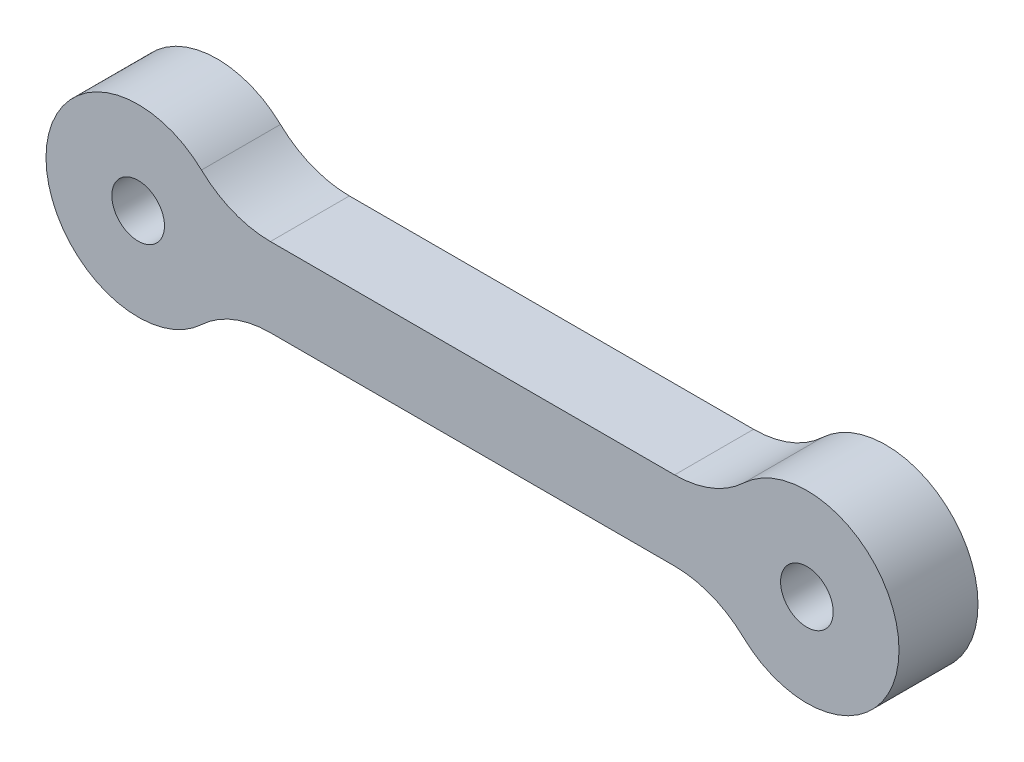
ISO-10303-21;
HEADER;
FILE_DESCRIPTION(('STEP AP214'),'2;1');
FILE_NAME('part.step','',(''),(''),'','','');
FILE_SCHEMA(('AUTOMOTIVE_DESIGN { 1 0 10303 214 1 1 1 1 }'));
ENDSEC;
DATA;
#1=APPLICATION_CONTEXT('core data for automotive mechanical design processes');
#2=APPLICATION_PROTOCOL_DEFINITION('international standard','automotive_design',2000,#1);
#3=PRODUCT_CONTEXT('',#1,'mechanical');
#4=PRODUCT('Part','Part','',(#3));
#5=PRODUCT_RELATED_PRODUCT_CATEGORY('part','',(#4));
#6=PRODUCT_DEFINITION_FORMATION('','',#4);
#7=PRODUCT_DEFINITION_CONTEXT('part definition',#1,'design');
#8=PRODUCT_DEFINITION('design','',#6,#7);
#9=PRODUCT_DEFINITION_SHAPE('','',#8);
#10=(LENGTH_UNIT() NAMED_UNIT(*) SI_UNIT(.MILLI.,.METRE.));
#11=(NAMED_UNIT(*) PLANE_ANGLE_UNIT() SI_UNIT($,.RADIAN.));
#12=(NAMED_UNIT(*) SI_UNIT($,.STERADIAN.) SOLID_ANGLE_UNIT());
#13=UNCERTAINTY_MEASURE_WITH_UNIT(LENGTH_MEASURE(1.E-05),#10,'distance_accuracy_value','');
#14=(GEOMETRIC_REPRESENTATION_CONTEXT(3) GLOBAL_UNCERTAINTY_ASSIGNED_CONTEXT((#13)) GLOBAL_UNIT_ASSIGNED_CONTEXT((#10,
#11,#12)) REPRESENTATION_CONTEXT('',''));
#15=CARTESIAN_POINT('',(0.,0.,0.));
#16=DIRECTION('',(0.,0.,1.));
#17=DIRECTION('',(1.,0.,0.));
#18=AXIS2_PLACEMENT_3D('',#15,#16,#17);
#19=CARTESIAN_POINT('',(12.7,0.,3.));
#20=DIRECTION('',(0.,0.,-1.));
#21=DIRECTION('',(-1.,0.,0.));
#22=AXIS2_PLACEMENT_3D('',#19,#20,#21);
#23=PLANE('',#22);
#24=DIRECTION('',(1.,0.,0.));
#25=VECTOR('',#24,1.);
#26=CARTESIAN_POINT('',(-9.53772233983162,-1.5,3.));
#27=LINE('',#26,#25);
#28=CARTESIAN_POINT('',(-7.6760573251678,-1.5,3.));
#29=VERTEX_POINT('',#28);
#30=CARTESIAN_POINT('',(7.67605732516781,-1.5,3.));
#31=VERTEX_POINT('',#30);
#32=EDGE_CURVE('E128',#29,#31,#27,.T.);
#33=ORIENTED_EDGE('',*,*,#32,.T.);
#34=CARTESIAN_POINT('',(7.67605732516781,-5.31,3.));
#35=DIRECTION('',(0.,0.,-1.));
#36=DIRECTION('',(-1.,0.,0.));
#37=AXIS2_PLACEMENT_3D('',#34,#35,#36);
#38=CIRCLE('',#37,3.81);
#39=CARTESIAN_POINT('',(10.2945554908464,-2.54240766073871,3.));
#40=VERTEX_POINT('',#39);
#41=EDGE_CURVE('E211',#31,#40,#38,.T.);
#42=ORIENTED_EDGE('',*,*,#41,.T.);
#43=CARTESIAN_POINT('',(12.7,0.,3.));
#44=DIRECTION('',(0.,0.,1.));
#45=DIRECTION('',(-1.,0.,0.));
#46=AXIS2_PLACEMENT_3D('',#43,#44,#45);
#47=CIRCLE('',#46,3.50000000000001);
#48=CARTESIAN_POINT('',(10.2945554908464,2.54240766073872,3.));
#49=VERTEX_POINT('',#48);
#50=EDGE_CURVE('E140',#40,#49,#47,.T.);
#51=ORIENTED_EDGE('',*,*,#50,.T.);
#52=CARTESIAN_POINT('',(7.6760573251678,5.31,3.));
#53=DIRECTION('',(0.,0.,-1.));
#54=DIRECTION('',(-1.,0.,0.));
#55=AXIS2_PLACEMENT_3D('',#52,#53,#54);
#56=CIRCLE('',#55,3.81);
#57=CARTESIAN_POINT('',(7.6760573251678,1.5,3.));
#58=VERTEX_POINT('',#57);
#59=EDGE_CURVE('E62',#49,#58,#56,.T.);
#60=ORIENTED_EDGE('',*,*,#59,.T.);
#61=DIRECTION('',(-1.,0.,0.));
#62=VECTOR('',#61,1.);
#63=CARTESIAN_POINT('',(-9.53772233983162,1.5,3.));
#64=LINE('',#63,#62);
#65=CARTESIAN_POINT('',(-7.67605732516781,1.5,3.));
#66=VERTEX_POINT('',#65);
#67=EDGE_CURVE('E139',#58,#66,#64,.T.);
#68=ORIENTED_EDGE('',*,*,#67,.T.);
#69=CARTESIAN_POINT('',(-7.67605732516781,5.31,3.));
#70=DIRECTION('',(0.,0.,-1.));
#71=DIRECTION('',(-1.,0.,0.));
#72=AXIS2_PLACEMENT_3D('',#69,#70,#71);
#73=CIRCLE('',#72,3.81);
#74=CARTESIAN_POINT('',(-10.2945554908464,2.54240766073871,3.));
#75=VERTEX_POINT('',#74);
#76=EDGE_CURVE('E12',#66,#75,#73,.T.);
#77=ORIENTED_EDGE('',*,*,#76,.T.);
#78=CARTESIAN_POINT('',(-12.7,0.,3.));
#79=DIRECTION('',(0.,0.,1.));
#80=DIRECTION('',(1.,0.,0.));
#81=AXIS2_PLACEMENT_3D('',#78,#79,#80);
#82=CIRCLE('',#81,3.5);
#83=CARTESIAN_POINT('',(-10.2945554908464,-2.54240766073872,3.));
#84=VERTEX_POINT('',#83);
#85=EDGE_CURVE('E200',#75,#84,#82,.T.);
#86=ORIENTED_EDGE('',*,*,#85,.T.);
#87=CARTESIAN_POINT('',(-7.6760573251678,-5.31,3.));
#88=DIRECTION('',(0.,0.,-1.));
#89=DIRECTION('',(-1.,0.,0.));
#90=AXIS2_PLACEMENT_3D('',#87,#88,#89);
#91=CIRCLE('',#90,3.81);
#92=EDGE_CURVE('E118',#84,#29,#91,.T.);
#93=ORIENTED_EDGE('',*,*,#92,.T.);
#94=EDGE_LOOP('',(#33,#42,#51,#60,#68,#77,#86,#93));
#95=FACE_BOUND('',#94,.T.);
#96=CARTESIAN_POINT('',(-12.7,0.,3.));
#97=DIRECTION('',(0.,0.,1.));
#98=DIRECTION('',(1.,0.,0.));
#99=AXIS2_PLACEMENT_3D('',#96,#97,#98);
#100=CIRCLE('',#99,1.);
#101=CARTESIAN_POINT('',(-11.7,0.,3.));
#102=VERTEX_POINT('',#101);
#103=EDGE_CURVE('E168',#102,#102,#100,.T.);
#104=ORIENTED_EDGE('',*,*,#103,.F.);
#105=EDGE_LOOP('',(#104));
#106=FACE_BOUND('',#105,.T.);
#107=CARTESIAN_POINT('',(12.7,0.,3.));
#108=DIRECTION('',(0.,0.,1.));
#109=DIRECTION('',(1.,0.,0.));
#110=AXIS2_PLACEMENT_3D('',#107,#108,#109);
#111=CIRCLE('',#110,1.00000000000002);
#112=CARTESIAN_POINT('',(13.7,0.,3.));
#113=VERTEX_POINT('',#112);
#114=EDGE_CURVE('E174',#113,#113,#111,.T.);
#115=ORIENTED_EDGE('',*,*,#114,.F.);
#116=EDGE_LOOP('',(#115));
#117=FACE_BOUND('',#116,.T.);
#118=ADVANCED_FACE('F45',(#95,#106,#117),#23,.F.);
#119=CARTESIAN_POINT('',(12.7,0.,0.));
#120=DIRECTION('',(0.,0.,-1.));
#121=DIRECTION('',(-1.,0.,0.));
#122=AXIS2_PLACEMENT_3D('',#119,#120,#121);
#123=PLANE('',#122);
#124=CARTESIAN_POINT('',(-12.7,0.,0.));
#125=DIRECTION('',(0.,0.,1.));
#126=DIRECTION('',(1.,0.,0.));
#127=AXIS2_PLACEMENT_3D('',#124,#125,#126);
#128=CIRCLE('',#127,1.);
#129=CARTESIAN_POINT('',(-11.7,0.,0.));
#130=VERTEX_POINT('',#129);
#131=EDGE_CURVE('E175',#130,#130,#128,.T.);
#132=ORIENTED_EDGE('',*,*,#131,.T.);
#133=EDGE_LOOP('',(#132));
#134=FACE_BOUND('',#133,.T.);
#135=CARTESIAN_POINT('',(12.7,0.,0.));
#136=DIRECTION('',(0.,0.,1.));
#137=DIRECTION('',(-1.,0.,0.));
#138=AXIS2_PLACEMENT_3D('',#135,#136,#137);
#139=CIRCLE('',#138,3.50000000000001);
#140=CARTESIAN_POINT('',(10.2945554908464,-2.54240766073871,0.));
#141=VERTEX_POINT('',#140);
#142=CARTESIAN_POINT('',(10.2945554908464,2.54240766073872,0.));
#143=VERTEX_POINT('',#142);
#144=EDGE_CURVE('E171',#141,#143,#139,.T.);
#145=ORIENTED_EDGE('',*,*,#144,.F.);
#146=CARTESIAN_POINT('',(7.67605732516781,-5.31,0.));
#147=DIRECTION('',(0.,0.,-1.));
#148=DIRECTION('',(-1.,0.,0.));
#149=AXIS2_PLACEMENT_3D('',#146,#147,#148);
#150=CIRCLE('',#149,3.81);
#151=CARTESIAN_POINT('',(7.67605732516781,-1.5,0.));
#152=VERTEX_POINT('',#151);
#153=EDGE_CURVE('E136',#141,#152,#150,.F.);
#154=ORIENTED_EDGE('',*,*,#153,.T.);
#155=DIRECTION('',(1.,0.,0.));
#156=VECTOR('',#155,1.);
#157=CARTESIAN_POINT('',(-9.53772233983162,-1.5,0.));
#158=LINE('',#157,#156);
#159=CARTESIAN_POINT('',(-7.6760573251678,-1.5,0.));
#160=VERTEX_POINT('',#159);
#161=EDGE_CURVE('E129',#160,#152,#158,.T.);
#162=ORIENTED_EDGE('',*,*,#161,.F.);
#163=CARTESIAN_POINT('',(-7.6760573251678,-5.31,0.));
#164=DIRECTION('',(0.,0.,-1.));
#165=DIRECTION('',(-1.,0.,0.));
#166=AXIS2_PLACEMENT_3D('',#163,#164,#165);
#167=CIRCLE('',#166,3.81);
#168=CARTESIAN_POINT('',(-10.2945554908464,-2.54240766073872,0.));
#169=VERTEX_POINT('',#168);
#170=EDGE_CURVE('E107',#160,#169,#167,.F.);
#171=ORIENTED_EDGE('',*,*,#170,.T.);
#172=CARTESIAN_POINT('',(-12.7,0.,0.));
#173=DIRECTION('',(0.,0.,1.));
#174=DIRECTION('',(1.,0.,0.));
#175=AXIS2_PLACEMENT_3D('',#172,#173,#174);
#176=CIRCLE('',#175,3.5);
#177=CARTESIAN_POINT('',(-10.2945554908464,2.54240766073871,0.));
#178=VERTEX_POINT('',#177);
#179=EDGE_CURVE('E138',#178,#169,#176,.T.);
#180=ORIENTED_EDGE('',*,*,#179,.F.);
#181=CARTESIAN_POINT('',(-7.67605732516781,5.31,0.));
#182=DIRECTION('',(0.,0.,-1.));
#183=DIRECTION('',(-1.,0.,0.));
#184=AXIS2_PLACEMENT_3D('',#181,#182,#183);
#185=CIRCLE('',#184,3.81);
#186=CARTESIAN_POINT('',(-7.67605732516781,1.5,0.));
#187=VERTEX_POINT('',#186);
#188=EDGE_CURVE('E51',#178,#187,#185,.F.);
#189=ORIENTED_EDGE('',*,*,#188,.T.);
#190=DIRECTION('',(-1.,0.,0.));
#191=VECTOR('',#190,1.);
#192=CARTESIAN_POINT('',(-9.53772233983162,1.5,0.));
#193=LINE('',#192,#191);
#194=CARTESIAN_POINT('',(7.6760573251678,1.5,0.));
#195=VERTEX_POINT('',#194);
#196=EDGE_CURVE('E145',#195,#187,#193,.T.);
#197=ORIENTED_EDGE('',*,*,#196,.F.);
#198=CARTESIAN_POINT('',(7.6760573251678,5.31,0.));
#199=DIRECTION('',(0.,0.,-1.));
#200=DIRECTION('',(-1.,0.,0.));
#201=AXIS2_PLACEMENT_3D('',#198,#199,#200);
#202=CIRCLE('',#201,3.81);
#203=EDGE_CURVE('E190',#195,#143,#202,.F.);
#204=ORIENTED_EDGE('',*,*,#203,.T.);
#205=EDGE_LOOP('',(#145,#154,#162,#171,#180,#189,#197,#204));
#206=FACE_BOUND('',#205,.T.);
#207=CARTESIAN_POINT('',(12.7,0.,0.));
#208=DIRECTION('',(0.,0.,1.));
#209=DIRECTION('',(1.,0.,0.));
#210=AXIS2_PLACEMENT_3D('',#207,#208,#209);
#211=CIRCLE('',#210,1.00000000000002);
#212=CARTESIAN_POINT('',(13.7,0.,0.));
#213=VERTEX_POINT('',#212);
#214=EDGE_CURVE('E173',#213,#213,#211,.T.);
#215=ORIENTED_EDGE('',*,*,#214,.T.);
#216=EDGE_LOOP('',(#215));
#217=FACE_BOUND('',#216,.T.);
#218=ADVANCED_FACE('F134',(#134,#206,#217),#123,.T.);
#219=CARTESIAN_POINT('',(12.7,0.,3.));
#220=DIRECTION('',(0.,0.,-1.));
#221=DIRECTION('',(-1.,0.,0.));
#222=AXIS2_PLACEMENT_3D('',#219,#220,#221);
#223=CYLINDRICAL_SURFACE('',#222,3.50000000000001);
#224=ORIENTED_EDGE('',*,*,#50,.F.);
#225=DIRECTION('',(0.,0.,-1.));
#226=VECTOR('',#225,1.);
#227=CARTESIAN_POINT('',(10.2945554908464,-2.54240766073871,3.));
#228=LINE('',#227,#226);
#229=EDGE_CURVE('E155',#40,#141,#228,.T.);
#230=ORIENTED_EDGE('',*,*,#229,.T.);
#231=ORIENTED_EDGE('',*,*,#144,.T.);
#232=DIRECTION('',(0.,0.,-1.));
#233=VECTOR('',#232,1.);
#234=CARTESIAN_POINT('',(10.2945554908464,2.54240766073872,3.));
#235=LINE('',#234,#233);
#236=EDGE_CURVE('E147',#143,#49,#235,.F.);
#237=ORIENTED_EDGE('',*,*,#236,.T.);
#238=EDGE_LOOP('',(#224,#230,#231,#237));
#239=FACE_BOUND('',#238,.T.);
#240=ADVANCED_FACE('F206',(#239),#223,.T.);
#241=CARTESIAN_POINT('',(-9.53772233983162,1.5,3.));
#242=DIRECTION('',(0.,-1.,0.));
#243=DIRECTION('',(1.,0.,0.));
#244=AXIS2_PLACEMENT_3D('',#241,#242,#243);
#245=PLANE('',#244);
#246=ORIENTED_EDGE('',*,*,#67,.F.);
#247=DIRECTION('',(0.,0.,1.));
#248=VECTOR('',#247,1.);
#249=CARTESIAN_POINT('',(7.6760573251678,1.5,0.));
#250=LINE('',#249,#248);
#251=EDGE_CURVE('E119',#58,#195,#250,.F.);
#252=ORIENTED_EDGE('',*,*,#251,.T.);
#253=ORIENTED_EDGE('',*,*,#196,.T.);
#254=DIRECTION('',(0.,0.,1.));
#255=VECTOR('',#254,1.);
#256=CARTESIAN_POINT('',(-7.67605732516781,1.5,3.));
#257=LINE('',#256,#255);
#258=EDGE_CURVE('E59',#187,#66,#257,.T.);
#259=ORIENTED_EDGE('',*,*,#258,.T.);
#260=EDGE_LOOP('',(#246,#252,#253,#259));
#261=FACE_BOUND('',#260,.T.);
#262=ADVANCED_FACE('F194',(#261),#245,.F.);
#263=CARTESIAN_POINT('',(-12.7,0.,3.));
#264=DIRECTION('',(0.,0.,-1.));
#265=DIRECTION('',(-1.,0.,0.));
#266=AXIS2_PLACEMENT_3D('',#263,#264,#265);
#267=CYLINDRICAL_SURFACE('',#266,3.5);
#268=ORIENTED_EDGE('',*,*,#179,.T.);
#269=DIRECTION('',(0.,0.,-1.));
#270=VECTOR('',#269,1.);
#271=CARTESIAN_POINT('',(-10.2945554908464,-2.54240766073872,3.));
#272=LINE('',#271,#270);
#273=EDGE_CURVE('E112',#169,#84,#272,.F.);
#274=ORIENTED_EDGE('',*,*,#273,.T.);
#275=ORIENTED_EDGE('',*,*,#85,.F.);
#276=DIRECTION('',(0.,0.,-1.));
#277=VECTOR('',#276,1.);
#278=CARTESIAN_POINT('',(-10.2945554908464,2.54240766073871,3.));
#279=LINE('',#278,#277);
#280=EDGE_CURVE('E127',#75,#178,#279,.T.);
#281=ORIENTED_EDGE('',*,*,#280,.T.);
#282=EDGE_LOOP('',(#268,#274,#275,#281));
#283=FACE_BOUND('',#282,.T.);
#284=ADVANCED_FACE('F199',(#283),#267,.T.);
#285=CARTESIAN_POINT('',(-9.53772233983162,-1.5,3.));
#286=DIRECTION('',(0.,1.,0.));
#287=DIRECTION('',(-1.,0.,0.));
#288=AXIS2_PLACEMENT_3D('',#285,#286,#287);
#289=PLANE('',#288);
#290=ORIENTED_EDGE('',*,*,#32,.F.);
#291=DIRECTION('',(0.,0.,1.));
#292=VECTOR('',#291,1.);
#293=CARTESIAN_POINT('',(-7.6760573251678,-1.5,0.));
#294=LINE('',#293,#292);
#295=EDGE_CURVE('E113',#29,#160,#294,.F.);
#296=ORIENTED_EDGE('',*,*,#295,.T.);
#297=ORIENTED_EDGE('',*,*,#161,.T.);
#298=DIRECTION('',(0.,0.,1.));
#299=VECTOR('',#298,1.);
#300=CARTESIAN_POINT('',(7.67605732516781,-1.5,3.));
#301=LINE('',#300,#299);
#302=EDGE_CURVE('E132',#152,#31,#301,.T.);
#303=ORIENTED_EDGE('',*,*,#302,.T.);
#304=EDGE_LOOP('',(#290,#296,#297,#303));
#305=FACE_BOUND('',#304,.T.);
#306=ADVANCED_FACE('F123',(#305),#289,.F.);
#307=CARTESIAN_POINT('',(-12.7,0.,3.));
#308=DIRECTION('',(0.,0.,-1.));
#309=DIRECTION('',(-1.,0.,0.));
#310=AXIS2_PLACEMENT_3D('',#307,#308,#309);
#311=CYLINDRICAL_SURFACE('',#310,1.);
#312=ORIENTED_EDGE('',*,*,#103,.T.);
#313=EDGE_LOOP('',(#312));
#314=FACE_BOUND('',#313,.T.);
#315=ORIENTED_EDGE('',*,*,#131,.F.);
#316=EDGE_LOOP('',(#315));
#317=FACE_BOUND('',#316,.T.);
#318=ADVANCED_FACE('F234',(#314,#317),#311,.F.);
#319=CARTESIAN_POINT('',(12.7,0.,3.));
#320=DIRECTION('',(0.,0.,-1.));
#321=DIRECTION('',(-1.,0.,0.));
#322=AXIS2_PLACEMENT_3D('',#319,#320,#321);
#323=CYLINDRICAL_SURFACE('',#322,1.00000000000002);
#324=ORIENTED_EDGE('',*,*,#114,.T.);
#325=EDGE_LOOP('',(#324));
#326=FACE_BOUND('',#325,.T.);
#327=ORIENTED_EDGE('',*,*,#214,.F.);
#328=EDGE_LOOP('',(#327));
#329=FACE_BOUND('',#328,.T.);
#330=ADVANCED_FACE('F221',(#326,#329),#323,.F.);
#331=CARTESIAN_POINT('',(-7.6760573251678,-5.31,3.));
#332=DIRECTION('',(0.,0.,-1.));
#333=DIRECTION('',(-1.,0.,0.));
#334=AXIS2_PLACEMENT_3D('',#331,#332,#333);
#335=CYLINDRICAL_SURFACE('',#334,3.81);
#336=ORIENTED_EDGE('',*,*,#92,.F.);
#337=ORIENTED_EDGE('',*,*,#273,.F.);
#338=ORIENTED_EDGE('',*,*,#170,.F.);
#339=ORIENTED_EDGE('',*,*,#295,.F.);
#340=EDGE_LOOP('',(#336,#337,#338,#339));
#341=FACE_BOUND('',#340,.T.);
#342=ADVANCED_FACE('F115',(#341),#335,.F.);
#343=CARTESIAN_POINT('',(7.67605732516781,-5.31,3.));
#344=DIRECTION('',(0.,0.,-1.));
#345=DIRECTION('',(-1.,0.,0.));
#346=AXIS2_PLACEMENT_3D('',#343,#344,#345);
#347=CYLINDRICAL_SURFACE('',#346,3.81);
#348=ORIENTED_EDGE('',*,*,#41,.F.);
#349=ORIENTED_EDGE('',*,*,#302,.F.);
#350=ORIENTED_EDGE('',*,*,#153,.F.);
#351=ORIENTED_EDGE('',*,*,#229,.F.);
#352=EDGE_LOOP('',(#348,#349,#350,#351));
#353=FACE_BOUND('',#352,.T.);
#354=ADVANCED_FACE('F218',(#353),#347,.F.);
#355=CARTESIAN_POINT('',(7.6760573251678,5.31,3.));
#356=DIRECTION('',(0.,0.,-1.));
#357=DIRECTION('',(-1.,0.,0.));
#358=AXIS2_PLACEMENT_3D('',#355,#356,#357);
#359=CYLINDRICAL_SURFACE('',#358,3.81);
#360=ORIENTED_EDGE('',*,*,#59,.F.);
#361=ORIENTED_EDGE('',*,*,#236,.F.);
#362=ORIENTED_EDGE('',*,*,#203,.F.);
#363=ORIENTED_EDGE('',*,*,#251,.F.);
#364=EDGE_LOOP('',(#360,#361,#362,#363));
#365=FACE_BOUND('',#364,.T.);
#366=ADVANCED_FACE('F214',(#365),#359,.F.);
#367=CARTESIAN_POINT('',(-7.67605732516781,5.31,3.));
#368=DIRECTION('',(0.,0.,-1.));
#369=DIRECTION('',(-1.,0.,0.));
#370=AXIS2_PLACEMENT_3D('',#367,#368,#369);
#371=CYLINDRICAL_SURFACE('',#370,3.81);
#372=ORIENTED_EDGE('',*,*,#76,.F.);
#373=ORIENTED_EDGE('',*,*,#258,.F.);
#374=ORIENTED_EDGE('',*,*,#188,.F.);
#375=ORIENTED_EDGE('',*,*,#280,.F.);
#376=EDGE_LOOP('',(#372,#373,#374,#375));
#377=FACE_BOUND('',#376,.T.);
#378=ADVANCED_FACE('F42',(#377),#371,.F.);
#379=CLOSED_SHELL('',(#118,#218,#240,#262,#284,#306,#318,#330,#342,#354,#366,#378));
#380=MANIFOLD_SOLID_BREP('B2',#379);
#381=ADVANCED_BREP_SHAPE_REPRESENTATION('',(#18,#380),#14);
#382=SHAPE_DEFINITION_REPRESENTATION(#9,#381);
ENDSEC;
END-ISO-10303-21;
